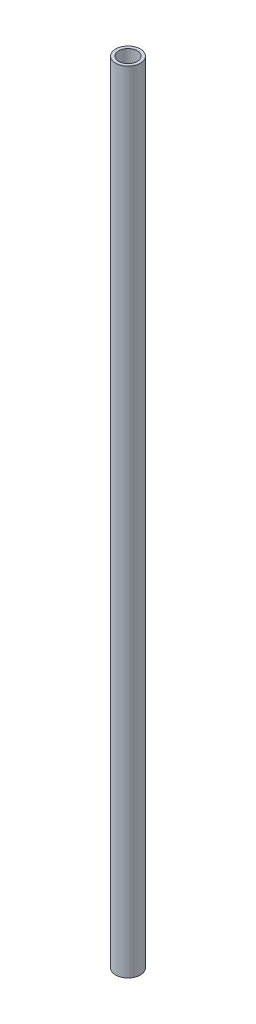
ISO-10303-21;
HEADER;
FILE_DESCRIPTION(('STEP AP214'),'2;1');
FILE_NAME('part.step','',(''),(''),'','','');
FILE_SCHEMA(('AUTOMOTIVE_DESIGN { 1 0 10303 214 1 1 1 1 }'));
ENDSEC;
DATA;
#1=APPLICATION_CONTEXT('core data for automotive mechanical design processes');
#2=APPLICATION_PROTOCOL_DEFINITION('international standard','automotive_design',2000,#1);
#3=PRODUCT_CONTEXT('',#1,'mechanical');
#4=PRODUCT('Part','Part','',(#3));
#5=PRODUCT_RELATED_PRODUCT_CATEGORY('part','',(#4));
#6=PRODUCT_DEFINITION_FORMATION('','',#4);
#7=PRODUCT_DEFINITION_CONTEXT('part definition',#1,'design');
#8=PRODUCT_DEFINITION('design','',#6,#7);
#9=PRODUCT_DEFINITION_SHAPE('','',#8);
#10=(LENGTH_UNIT() NAMED_UNIT(*) SI_UNIT(.MILLI.,.METRE.));
#11=(NAMED_UNIT(*) PLANE_ANGLE_UNIT() SI_UNIT($,.RADIAN.));
#12=(NAMED_UNIT(*) SI_UNIT($,.STERADIAN.) SOLID_ANGLE_UNIT());
#13=UNCERTAINTY_MEASURE_WITH_UNIT(LENGTH_MEASURE(1.E-05),#10,'distance_accuracy_value','');
#14=(GEOMETRIC_REPRESENTATION_CONTEXT(3) GLOBAL_UNCERTAINTY_ASSIGNED_CONTEXT((#13)) GLOBAL_UNIT_ASSIGNED_CONTEXT((#10,
#11,#12)) REPRESENTATION_CONTEXT('',''));
#15=CARTESIAN_POINT('',(0.,0.,0.));
#16=DIRECTION('',(0.,0.,1.));
#17=DIRECTION('',(1.,0.,0.));
#18=AXIS2_PLACEMENT_3D('',#15,#16,#17);
#19=CARTESIAN_POINT('',(0.,101.6,0.));
#20=DIRECTION('',(0.,-1.,0.));
#21=DIRECTION('',(0.,0.,-1.));
#22=AXIS2_PLACEMENT_3D('',#19,#20,#21);
#23=CYLINDRICAL_SURFACE('',#22,1.5875);
#24=CARTESIAN_POINT('',(0.,101.6,0.));
#25=DIRECTION('',(0.,1.,0.));
#26=DIRECTION('',(0.,0.,1.));
#27=AXIS2_PLACEMENT_3D('',#24,#25,#26);
#28=CIRCLE('',#27,1.5875);
#29=CARTESIAN_POINT('',(0.,101.6,1.5875));
#30=VERTEX_POINT('',#29);
#31=EDGE_CURVE('E10',#30,#30,#28,.T.);
#32=ORIENTED_EDGE('',*,*,#31,.F.);
#33=EDGE_LOOP('',(#32));
#34=FACE_BOUND('',#33,.T.);
#35=CARTESIAN_POINT('',(0.,0.,0.));
#36=DIRECTION('',(0.,1.,0.));
#37=DIRECTION('',(0.,0.,1.));
#38=AXIS2_PLACEMENT_3D('',#35,#36,#37);
#39=CIRCLE('',#38,1.5875);
#40=CARTESIAN_POINT('',(0.,0.,1.5875));
#41=VERTEX_POINT('',#40);
#42=EDGE_CURVE('E34',#41,#41,#39,.T.);
#43=ORIENTED_EDGE('',*,*,#42,.T.);
#44=EDGE_LOOP('',(#43));
#45=FACE_BOUND('',#44,.T.);
#46=ADVANCED_FACE('F31',(#34,#45),#23,.T.);
#47=CARTESIAN_POINT('',(0.,101.6,0.));
#48=DIRECTION('',(0.,1.,0.));
#49=DIRECTION('',(0.,0.,1.));
#50=AXIS2_PLACEMENT_3D('',#47,#48,#49);
#51=PLANE('',#50);
#52=CARTESIAN_POINT('',(0.,101.6,0.));
#53=DIRECTION('',(0.,1.,0.));
#54=DIRECTION('',(0.,0.,1.));
#55=AXIS2_PLACEMENT_3D('',#52,#53,#54);
#56=CIRCLE('',#55,1.190625);
#57=CARTESIAN_POINT('',(0.,101.6,1.190625));
#58=VERTEX_POINT('',#57);
#59=EDGE_CURVE('E43',#58,#58,#56,.T.);
#60=ORIENTED_EDGE('',*,*,#59,.F.);
#61=EDGE_LOOP('',(#60));
#62=FACE_BOUND('',#61,.T.);
#63=ORIENTED_EDGE('',*,*,#31,.T.);
#64=EDGE_LOOP('',(#63));
#65=FACE_BOUND('',#64,.T.);
#66=ADVANCED_FACE('F58',(#62,#65),#51,.T.);
#67=CARTESIAN_POINT('',(0.,0.,0.));
#68=DIRECTION('',(0.,1.,0.));
#69=DIRECTION('',(0.,0.,1.));
#70=AXIS2_PLACEMENT_3D('',#67,#68,#69);
#71=PLANE('',#70);
#72=CARTESIAN_POINT('',(0.,0.,0.));
#73=DIRECTION('',(0.,1.,0.));
#74=DIRECTION('',(0.,0.,1.));
#75=AXIS2_PLACEMENT_3D('',#72,#73,#74);
#76=CIRCLE('',#75,1.190625);
#77=CARTESIAN_POINT('',(0.,0.,1.190625));
#78=VERTEX_POINT('',#77);
#79=EDGE_CURVE('E41',#78,#78,#76,.T.);
#80=ORIENTED_EDGE('',*,*,#79,.T.);
#81=EDGE_LOOP('',(#80));
#82=FACE_BOUND('',#81,.T.);
#83=ORIENTED_EDGE('',*,*,#42,.F.);
#84=EDGE_LOOP('',(#83));
#85=FACE_BOUND('',#84,.T.);
#86=ADVANCED_FACE('F49',(#82,#85),#71,.F.);
#87=CARTESIAN_POINT('',(0.,0.,0.));
#88=DIRECTION('',(0.,1.,0.));
#89=DIRECTION('',(0.,0.,1.));
#90=AXIS2_PLACEMENT_3D('',#87,#88,#89);
#91=CYLINDRICAL_SURFACE('',#90,1.190625);
#92=ORIENTED_EDGE('',*,*,#79,.F.);
#93=EDGE_LOOP('',(#92));
#94=FACE_BOUND('',#93,.T.);
#95=ORIENTED_EDGE('',*,*,#59,.T.);
#96=EDGE_LOOP('',(#95));
#97=FACE_BOUND('',#96,.T.);
#98=ADVANCED_FACE('F52',(#94,#97),#91,.F.);
#99=CLOSED_SHELL('',(#46,#66,#86,#98));
#100=MANIFOLD_SOLID_BREP('B2',#99);
#101=ADVANCED_BREP_SHAPE_REPRESENTATION('',(#18,#100),#14);
#102=SHAPE_DEFINITION_REPRESENTATION(#9,#101);
ENDSEC;
END-ISO-10303-21;
